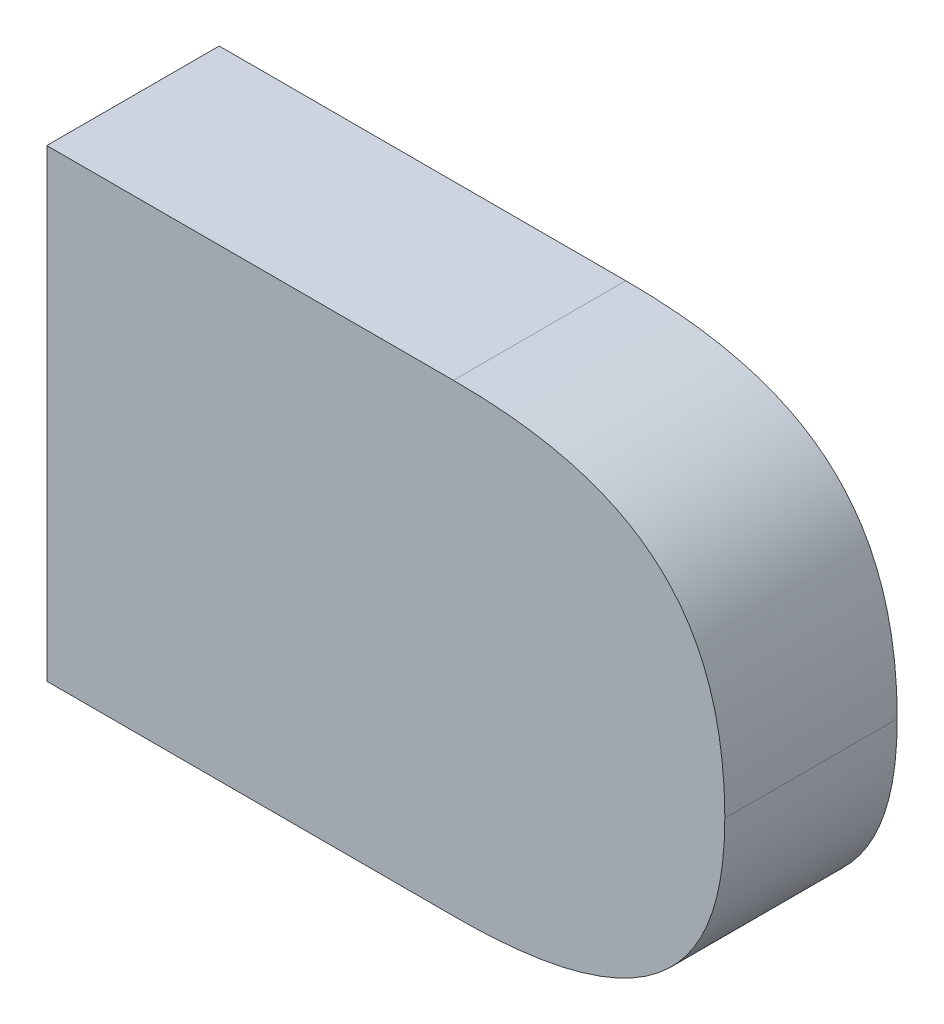
ISO-10303-21;
HEADER;
FILE_DESCRIPTION(('STEP AP214'),'2;1');
FILE_NAME('part.step','',(''),(''),'','','');
FILE_SCHEMA(('AUTOMOTIVE_DESIGN { 1 0 10303 214 1 1 1 1 }'));
ENDSEC;
DATA;
#1=APPLICATION_CONTEXT('core data for automotive mechanical design processes');
#2=APPLICATION_PROTOCOL_DEFINITION('international standard','automotive_design',2000,#1);
#3=PRODUCT_CONTEXT('',#1,'mechanical');
#4=PRODUCT('Part','Part','',(#3));
#5=PRODUCT_RELATED_PRODUCT_CATEGORY('part','',(#4));
#6=PRODUCT_DEFINITION_FORMATION('','',#4);
#7=PRODUCT_DEFINITION_CONTEXT('part definition',#1,'design');
#8=PRODUCT_DEFINITION('design','',#6,#7);
#9=PRODUCT_DEFINITION_SHAPE('','',#8);
#10=(LENGTH_UNIT() NAMED_UNIT(*) SI_UNIT(.MILLI.,.METRE.));
#11=(NAMED_UNIT(*) PLANE_ANGLE_UNIT() SI_UNIT($,.RADIAN.));
#12=(NAMED_UNIT(*) SI_UNIT($,.STERADIAN.) SOLID_ANGLE_UNIT());
#13=UNCERTAINTY_MEASURE_WITH_UNIT(LENGTH_MEASURE(1.E-05),#10,'distance_accuracy_value','');
#14=(GEOMETRIC_REPRESENTATION_CONTEXT(3) GLOBAL_UNCERTAINTY_ASSIGNED_CONTEXT((#13)) GLOBAL_UNIT_ASSIGNED_CONTEXT((#10,
#11,#12)) REPRESENTATION_CONTEXT('',''));
#15=CARTESIAN_POINT('',(0.,0.,0.));
#16=DIRECTION('',(0.,0.,1.));
#17=DIRECTION('',(1.,0.,0.));
#18=AXIS2_PLACEMENT_3D('',#15,#16,#17);
#19=CARTESIAN_POINT('',(24.06895625039,-1.898248019438,-5.5));
#20=DIRECTION('',(0.,0.,-1.));
#21=DIRECTION('',(-1.,0.,0.));
#22=AXIS2_PLACEMENT_3D('',#19,#20,#21);
#23=PLANE('',#22);
#24=DIRECTION('',(0.,1.,0.));
#25=VECTOR('',#24,1.);
#26=CARTESIAN_POINT('',(22.18731541969,-3.242983083634,-5.5));
#27=LINE('',#26,#25);
#28=CARTESIAN_POINT('',(22.18731541969,-3.242983083634,-5.5));
#29=VERTEX_POINT('',#28);
#30=CARTESIAN_POINT('',(22.18731541969,-0.552476794746,-5.5));
#31=VERTEX_POINT('',#30);
#32=EDGE_CURVE('E111',#29,#31,#27,.T.);
#33=ORIENTED_EDGE('',*,*,#32,.F.);
#34=DIRECTION('',(-1.,0.,0.));
#35=VECTOR('',#34,1.);
#36=CARTESIAN_POINT('',(24.55594444192,-3.242983083634,-5.5));
#37=LINE('',#36,#35);
#38=CARTESIAN_POINT('',(24.55594444192,-3.242983083634,-5.5));
#39=VERTEX_POINT('',#38);
#40=EDGE_CURVE('E31',#39,#29,#37,.T.);
#41=ORIENTED_EDGE('',*,*,#40,.F.);
#42=CARTESIAN_POINT('',(26.11965875303,-1.965402594746,-5.5));
#43=CARTESIAN_POINT('',(26.11965875303,-2.780415216968,-5.5));
#44=CARTESIAN_POINT('',(25.68997824192,-3.242983083634,-5.5));
#45=CARTESIAN_POINT('',(24.55594444192,-3.242983083634,-5.5));
#46=(BOUNDED_CURVE() B_SPLINE_CURVE(3,(#42,#43,#44,#45),.UNSPECIFIED.,.F.,
.F.) B_SPLINE_CURVE_WITH_KNOTS((4,4),(0.,1.),
.UNSPECIFIED.) CURVE() GEOMETRIC_REPRESENTATION_ITEM() RATIONAL_B_SPLINE_CURVE((1.,1.,1.,1.)) REPRESENTATION_ITEM(''));
#47=CARTESIAN_POINT('',(26.11965875303,-1.965402594746,-5.5));
#48=VERTEX_POINT('',#47);
#49=EDGE_CURVE('E81',#48,#39,#46,.T.);
#50=ORIENTED_EDGE('',*,*,#49,.F.);
#51=CARTESIAN_POINT('',(24.54548246414,-0.552476794746,-5.5));
#52=CARTESIAN_POINT('',(25.52150004192,-0.552476794746,-5.5));
#53=CARTESIAN_POINT('',(26.11965875303,-0.893742728079,-5.5));
#54=CARTESIAN_POINT('',(26.11965875303,-1.965402594746,-5.5));
#55=(BOUNDED_CURVE() B_SPLINE_CURVE(3,(#51,#52,#53,#54),.UNSPECIFIED.,.F.,
.F.) B_SPLINE_CURVE_WITH_KNOTS((4,4),(0.,1.),
.UNSPECIFIED.) CURVE() GEOMETRIC_REPRESENTATION_ITEM() RATIONAL_B_SPLINE_CURVE((1.,1.,1.,1.)) REPRESENTATION_ITEM(''));
#56=CARTESIAN_POINT('',(24.54548246414,-0.552476794746,-5.5));
#57=VERTEX_POINT('',#56);
#58=EDGE_CURVE('E22',#57,#48,#55,.T.);
#59=ORIENTED_EDGE('',*,*,#58,.F.);
#60=DIRECTION('',(1.,0.,0.));
#61=VECTOR('',#60,1.);
#62=CARTESIAN_POINT('',(22.18731541969,-0.552476794746,-5.5));
#63=LINE('',#62,#61);
#64=EDGE_CURVE('E78',#31,#57,#63,.T.);
#65=ORIENTED_EDGE('',*,*,#64,.F.);
#66=EDGE_LOOP('',(#33,#41,#50,#59,#65));
#67=FACE_BOUND('',#66,.T.);
#68=ADVANCED_FACE('F16',(#67),#23,.F.);
#69=CARTESIAN_POINT('',(24.06895625039,-1.898248019438,-6.5));
#70=DIRECTION('',(0.,0.,-1.));
#71=DIRECTION('',(-1.,0.,0.));
#72=AXIS2_PLACEMENT_3D('',#69,#70,#71);
#73=PLANE('',#72);
#74=DIRECTION('',(0.,1.,0.));
#75=VECTOR('',#74,1.);
#76=CARTESIAN_POINT('',(22.18731541969,-3.242983083634,-6.5));
#77=LINE('',#76,#75);
#78=CARTESIAN_POINT('',(22.18731541969,-3.242983083634,-6.5));
#79=VERTEX_POINT('',#78);
#80=CARTESIAN_POINT('',(22.18731541969,-0.552476794746,-6.5));
#81=VERTEX_POINT('',#80);
#82=EDGE_CURVE('E101',#79,#81,#77,.T.);
#83=ORIENTED_EDGE('',*,*,#82,.T.);
#84=DIRECTION('',(1.,0.,0.));
#85=VECTOR('',#84,1.);
#86=CARTESIAN_POINT('',(22.18731541969,-0.552476794746,-6.5));
#87=LINE('',#86,#85);
#88=CARTESIAN_POINT('',(24.54548246414,-0.552476794746,-6.5));
#89=VERTEX_POINT('',#88);
#90=EDGE_CURVE('E87',#81,#89,#87,.T.);
#91=ORIENTED_EDGE('',*,*,#90,.T.);
#92=CARTESIAN_POINT('',(24.54548246414,-0.552476794746,-6.5));
#93=CARTESIAN_POINT('',(25.52150004192,-0.552476794746,-6.5));
#94=CARTESIAN_POINT('',(26.11965875303,-0.893742728079,-6.5));
#95=CARTESIAN_POINT('',(26.11965875303,-1.965402594746,-6.5));
#96=(BOUNDED_CURVE() B_SPLINE_CURVE(3,(#92,#93,#94,#95),.UNSPECIFIED.,.F.,
.F.) B_SPLINE_CURVE_WITH_KNOTS((4,4),(0.,1.),
.UNSPECIFIED.) CURVE() GEOMETRIC_REPRESENTATION_ITEM() RATIONAL_B_SPLINE_CURVE((1.,1.,1.,1.)) REPRESENTATION_ITEM(''));
#97=CARTESIAN_POINT('',(26.11965875303,-1.965402594746,-6.5));
#98=VERTEX_POINT('',#97);
#99=EDGE_CURVE('E91',#89,#98,#96,.T.);
#100=ORIENTED_EDGE('',*,*,#99,.T.);
#101=CARTESIAN_POINT('',(26.11965875303,-1.965402594746,-6.5));
#102=CARTESIAN_POINT('',(26.11965875303,-2.780415216968,-6.5));
#103=CARTESIAN_POINT('',(25.68997824192,-3.242983083634,-6.5));
#104=CARTESIAN_POINT('',(24.55594444192,-3.242983083634,-6.5));
#105=(BOUNDED_CURVE() B_SPLINE_CURVE(3,(#101,#102,#103,#104),.UNSPECIFIED.,.F.,
.F.) B_SPLINE_CURVE_WITH_KNOTS((4,4),(0.,1.),
.UNSPECIFIED.) CURVE() GEOMETRIC_REPRESENTATION_ITEM() RATIONAL_B_SPLINE_CURVE((1.,1.,1.,1.)) REPRESENTATION_ITEM(''));
#106=CARTESIAN_POINT('',(24.55594444192,-3.242983083634,-6.5));
#107=VERTEX_POINT('',#106);
#108=EDGE_CURVE('E121',#98,#107,#105,.T.);
#109=ORIENTED_EDGE('',*,*,#108,.T.);
#110=DIRECTION('',(-1.,0.,0.));
#111=VECTOR('',#110,1.);
#112=CARTESIAN_POINT('',(24.55594444192,-3.242983083634,-6.5));
#113=LINE('',#112,#111);
#114=EDGE_CURVE('E11',#107,#79,#113,.T.);
#115=ORIENTED_EDGE('',*,*,#114,.T.);
#116=EDGE_LOOP('',(#83,#91,#100,#109,#115));
#117=FACE_BOUND('',#116,.T.);
#118=ADVANCED_FACE('F155',(#117),#73,.T.);
#119=CARTESIAN_POINT('',(23.371629930805,-3.242983083634,-5.49));
#120=DIRECTION('',(0.,-1.,0.));
#121=DIRECTION('',(0.,0.,1.));
#122=AXIS2_PLACEMENT_3D('',#119,#120,#121);
#123=PLANE('',#122);
#124=DIRECTION('',(0.,0.,1.));
#125=VECTOR('',#124,1.);
#126=CARTESIAN_POINT('',(24.55594444192,-3.242983083634,-6.5));
#127=LINE('',#126,#125);
#128=EDGE_CURVE('E108',#107,#39,#127,.T.);
#129=ORIENTED_EDGE('',*,*,#128,.T.);
#130=ORIENTED_EDGE('',*,*,#40,.T.);
#131=DIRECTION('',(0.,0.,1.));
#132=VECTOR('',#131,1.);
#133=CARTESIAN_POINT('',(22.18731541969,-3.242983083634,-6.5));
#134=LINE('',#133,#132);
#135=EDGE_CURVE('E114',#79,#29,#134,.T.);
#136=ORIENTED_EDGE('',*,*,#135,.F.);
#137=ORIENTED_EDGE('',*,*,#114,.F.);
#138=EDGE_LOOP('',(#129,#130,#136,#137));
#139=FACE_BOUND('',#138,.T.);
#140=ADVANCED_FACE('F162',(#139),#123,.T.);
#141=CARTESIAN_POINT('',(26.11965875303,-1.965402594746,-5.499));
#142=CARTESIAN_POINT('',(26.11965875303,-1.965402594746,-6.501));
#143=CARTESIAN_POINT('',(26.11965875303,-2.780415216968,-5.499));
#144=CARTESIAN_POINT('',(26.11965875303,-2.780415216968,-6.501));
#145=CARTESIAN_POINT('',(25.68997824192,-3.242983083634,-5.499));
#146=CARTESIAN_POINT('',(25.68997824192,-3.242983083634,-6.501));
#147=CARTESIAN_POINT('',(24.55594444192,-3.242983083634,-5.499));
#148=CARTESIAN_POINT('',(24.55594444192,-3.242983083634,-6.501));
#149=(BOUNDED_SURFACE() B_SPLINE_SURFACE(3,1,((#141,#142),(#143,#144),(#145,#146),(#147,#148)),
.UNSPECIFIED.,.F.,.F.,.F.) B_SPLINE_SURFACE_WITH_KNOTS((4,4),(2,2),(0.,1.),(-1.001,0.001),
.UNSPECIFIED.) GEOMETRIC_REPRESENTATION_ITEM() RATIONAL_B_SPLINE_SURFACE(((1.,1.),(1.,1.),(1.,
1.),(1.,1.))) REPRESENTATION_ITEM('') SURFACE());
#150=DIRECTION('',(0.,0.,1.));
#151=VECTOR('',#150,1.);
#152=CARTESIAN_POINT('',(26.11965875303,-1.965402594746,-6.5));
#153=LINE('',#152,#151);
#154=EDGE_CURVE('E86',#98,#48,#153,.T.);
#155=ORIENTED_EDGE('',*,*,#154,.T.);
#156=ORIENTED_EDGE('',*,*,#49,.T.);
#157=ORIENTED_EDGE('',*,*,#128,.F.);
#158=ORIENTED_EDGE('',*,*,#108,.F.);
#159=EDGE_LOOP('',(#155,#156,#157,#158));
#160=FACE_BOUND('',#159,.T.);
#161=ADVANCED_FACE('F154',(#160),#149,.T.);
#162=CARTESIAN_POINT('',(24.54548246414,-0.552476794746,-5.499));
#163=CARTESIAN_POINT('',(24.54548246414,-0.552476794746,-6.501));
#164=CARTESIAN_POINT('',(25.52150004192,-0.552476794746,-5.499));
#165=CARTESIAN_POINT('',(25.52150004192,-0.552476794746,-6.501));
#166=CARTESIAN_POINT('',(26.11965875303,-0.893742728079,-5.499));
#167=CARTESIAN_POINT('',(26.11965875303,-0.893742728079,-6.501));
#168=CARTESIAN_POINT('',(26.11965875303,-1.965402594746,-5.499));
#169=CARTESIAN_POINT('',(26.11965875303,-1.965402594746,-6.501));
#170=(BOUNDED_SURFACE() B_SPLINE_SURFACE(3,1,((#162,#163),(#164,#165),(#166,#167),(#168,#169)),
.UNSPECIFIED.,.F.,.F.,.F.) B_SPLINE_SURFACE_WITH_KNOTS((4,4),(2,2),(0.,1.),(-1.001,0.001),
.UNSPECIFIED.) GEOMETRIC_REPRESENTATION_ITEM() RATIONAL_B_SPLINE_SURFACE(((1.,1.),(1.,1.),(1.,
1.),(1.,1.))) REPRESENTATION_ITEM('') SURFACE());
#171=DIRECTION('',(0.,0.,1.));
#172=VECTOR('',#171,1.);
#173=CARTESIAN_POINT('',(24.54548246414,-0.552476794746,-6.5));
#174=LINE('',#173,#172);
#175=EDGE_CURVE('E89',#89,#57,#174,.T.);
#176=ORIENTED_EDGE('',*,*,#175,.T.);
#177=ORIENTED_EDGE('',*,*,#58,.T.);
#178=ORIENTED_EDGE('',*,*,#154,.F.);
#179=ORIENTED_EDGE('',*,*,#99,.F.);
#180=EDGE_LOOP('',(#176,#177,#178,#179));
#181=FACE_BOUND('',#180,.T.);
#182=ADVANCED_FACE('F18',(#181),#170,.T.);
#183=CARTESIAN_POINT('',(23.366398941915,-0.552476794746,-5.49));
#184=DIRECTION('',(0.,1.,0.));
#185=DIRECTION('',(-1.,0.,0.));
#186=AXIS2_PLACEMENT_3D('',#183,#184,#185);
#187=PLANE('',#186);
#188=DIRECTION('',(0.,0.,1.));
#189=VECTOR('',#188,1.);
#190=CARTESIAN_POINT('',(22.18731541969,-0.552476794746,-6.5));
#191=LINE('',#190,#189);
#192=EDGE_CURVE('E98',#81,#31,#191,.T.);
#193=ORIENTED_EDGE('',*,*,#192,.T.);
#194=ORIENTED_EDGE('',*,*,#64,.T.);
#195=ORIENTED_EDGE('',*,*,#175,.F.);
#196=ORIENTED_EDGE('',*,*,#90,.F.);
#197=EDGE_LOOP('',(#193,#194,#195,#196));
#198=FACE_BOUND('',#197,.T.);
#199=ADVANCED_FACE('F96',(#198),#187,.T.);
#200=CARTESIAN_POINT('',(22.18731541969,-1.89772993919,-5.49));
#201=DIRECTION('',(-1.,0.,0.));
#202=DIRECTION('',(0.,1.,0.));
#203=AXIS2_PLACEMENT_3D('',#200,#201,#202);
#204=PLANE('',#203);
#205=ORIENTED_EDGE('',*,*,#135,.T.);
#206=ORIENTED_EDGE('',*,*,#32,.T.);
#207=ORIENTED_EDGE('',*,*,#192,.F.);
#208=ORIENTED_EDGE('',*,*,#82,.F.);
#209=EDGE_LOOP('',(#205,#206,#207,#208));
#210=FACE_BOUND('',#209,.T.);
#211=ADVANCED_FACE('F158',(#210),#204,.T.);
#212=CLOSED_SHELL('',(#68,#118,#140,#161,#182,#199,#211));
#213=MANIFOLD_SOLID_BREP('B1',#212);
#214=ADVANCED_BREP_SHAPE_REPRESENTATION('',(#18,#213),#14);
#215=SHAPE_DEFINITION_REPRESENTATION(#9,#214);
ENDSEC;
END-ISO-10303-21;
